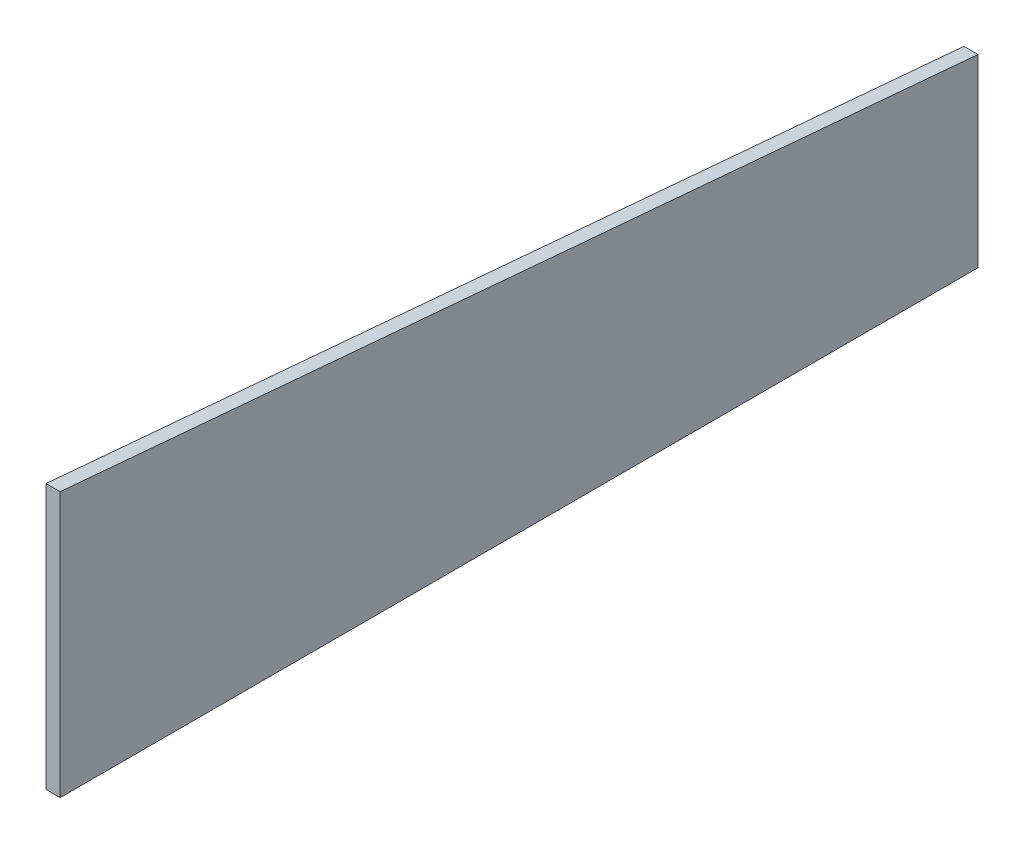
ISO-10303-21;
HEADER;
FILE_DESCRIPTION(('STEP AP214'),'2;1');
FILE_NAME('part.step','',(''),(''),'','','');
FILE_SCHEMA(('AUTOMOTIVE_DESIGN { 1 0 10303 214 1 1 1 1 }'));
ENDSEC;
DATA;
#1=APPLICATION_CONTEXT('core data for automotive mechanical design processes');
#2=APPLICATION_PROTOCOL_DEFINITION('international standard','automotive_design',2000,#1);
#3=PRODUCT_CONTEXT('',#1,'mechanical');
#4=PRODUCT('Part','Part','',(#3));
#5=PRODUCT_RELATED_PRODUCT_CATEGORY('part','',(#4));
#6=PRODUCT_DEFINITION_FORMATION('','',#4);
#7=PRODUCT_DEFINITION_CONTEXT('part definition',#1,'design');
#8=PRODUCT_DEFINITION('design','',#6,#7);
#9=PRODUCT_DEFINITION_SHAPE('','',#8);
#10=(LENGTH_UNIT() NAMED_UNIT(*) SI_UNIT(.MILLI.,.METRE.));
#11=(NAMED_UNIT(*) PLANE_ANGLE_UNIT() SI_UNIT($,.RADIAN.));
#12=(NAMED_UNIT(*) SI_UNIT($,.STERADIAN.) SOLID_ANGLE_UNIT());
#13=UNCERTAINTY_MEASURE_WITH_UNIT(LENGTH_MEASURE(1.E-05),#10,'distance_accuracy_value','');
#14=(GEOMETRIC_REPRESENTATION_CONTEXT(3) GLOBAL_UNCERTAINTY_ASSIGNED_CONTEXT((#13)) GLOBAL_UNIT_ASSIGNED_CONTEXT((#10,
#11,#12)) REPRESENTATION_CONTEXT('',''));
#15=CARTESIAN_POINT('',(0.,0.,0.));
#16=DIRECTION('',(0.,0.,1.));
#17=DIRECTION('',(1.,0.,0.));
#18=AXIS2_PLACEMENT_3D('',#15,#16,#17);
#19=CARTESIAN_POINT('',(75.3557689069101,0.,3.4487766090119));
#20=DIRECTION('',(-0.998954351961386,0.,-0.0457187346435417));
#21=DIRECTION('',(-0.0457187346435417,0.,0.998954351961386));
#22=AXIS2_PLACEMENT_3D('',#19,#20,#21);
#23=PLANE('',#22);
#24=DIRECTION('',(0.,-1.,0.));
#25=VECTOR('',#24,1.);
#26=CARTESIAN_POINT('',(36.8866053649885,0.,844.));
#27=LINE('',#26,#25);
#28=CARTESIAN_POINT('',(36.8866053649885,268.113394635012,844.));
#29=VERTEX_POINT('',#28);
#30=CARTESIAN_POINT('',(36.8866053649885,23.8729977116705,844.));
#31=VERTEX_POINT('',#30);
#32=EDGE_CURVE('E100',#29,#31,#27,.T.);
#33=ORIENTED_EDGE('',*,*,#32,.T.);
#34=DIRECTION('',(-0.0456710287056019,-0.0456710287056019,0.997911977217402));
#35=VECTOR('',#34,1.);
#36=CARTESIAN_POINT('',(75.2257329547936,62.2121253014756,6.29006216275832));
#37=LINE('',#36,#35);
#38=CARTESIAN_POINT('',(73.9117769896424,60.8981693363844,35.));
#39=VERTEX_POINT('',#38);
#40=EDGE_CURVE('E57',#39,#31,#37,.T.);
#41=ORIENTED_EDGE('',*,*,#40,.F.);
#42=DIRECTION('',(0.,-1.,0.));
#43=VECTOR('',#42,1.);
#44=CARTESIAN_POINT('',(73.9117769897024,0.,35.));
#45=LINE('',#44,#43);
#46=CARTESIAN_POINT('',(73.9117769896424,231.088223010298,35.));
#47=VERTEX_POINT('',#46);
#48=EDGE_CURVE('E11',#47,#39,#45,.T.);
#49=ORIENTED_EDGE('',*,*,#48,.F.);
#50=DIRECTION('',(-0.0456710287056019,0.045671028705602,0.997911977217402));
#51=VECTOR('',#50,1.);
#52=CARTESIAN_POINT('',(75.8347706873712,229.165229312629,-7.01741229406215));
#53=LINE('',#52,#51);
#54=EDGE_CURVE('E36',#47,#29,#53,.T.);
#55=ORIENTED_EDGE('',*,*,#54,.T.);
#56=EDGE_LOOP('',(#33,#41,#49,#55));
#57=FACE_BOUND('',#56,.T.);
#58=ADVANCED_FACE('F32',(#57),#23,.F.);
#59=CARTESIAN_POINT('',(0.,229.006719270381,-10.4808567171799));
#60=DIRECTION('',(0.,0.998954351961386,-0.0457187346435418));
#61=DIRECTION('',(0.,0.0457187346435418,0.998954351961386));
#62=AXIS2_PLACEMENT_3D('',#59,#60,#61);
#63=PLANE('',#62);
#64=DIRECTION('',(-1.,0.,0.));
#65=VECTOR('',#64,1.);
#66=CARTESIAN_POINT('',(0.,268.113394635012,844.));
#67=LINE('',#66,#65);
#68=CARTESIAN_POINT('',(23.8729977116705,268.113394635012,844.));
#69=VERTEX_POINT('',#68);
#70=EDGE_CURVE('E82',#29,#69,#67,.T.);
#71=ORIENTED_EDGE('',*,*,#70,.F.);
#72=ORIENTED_EDGE('',*,*,#54,.F.);
#73=DIRECTION('',(-1.,0.,0.));
#74=VECTOR('',#73,1.);
#75=CARTESIAN_POINT('',(0.,231.088223010298,35.));
#76=LINE('',#75,#74);
#77=CARTESIAN_POINT('',(60.8981693363844,231.088223010298,35.));
#78=VERTEX_POINT('',#77);
#79=EDGE_CURVE('E81',#47,#78,#76,.T.);
#80=ORIENTED_EDGE('',*,*,#79,.T.);
#81=DIRECTION('',(-0.0456710287056019,0.045671028705602,0.997911977217402));
#82=VECTOR('',#81,1.);
#83=CARTESIAN_POINT('',(62.8483073746991,229.138084971983,-7.61051613717548));
#84=LINE('',#83,#82);
#85=EDGE_CURVE('E93',#78,#69,#84,.T.);
#86=ORIENTED_EDGE('',*,*,#85,.T.);
#87=EDGE_LOOP('',(#71,#72,#80,#86));
#88=FACE_BOUND('',#87,.T.);
#89=ADVANCED_FACE('F78',(#88),#63,.T.);
#90=CARTESIAN_POINT('',(0.,0.,35.));
#91=DIRECTION('',(0.,0.,-1.));
#92=DIRECTION('',(-1.,0.,0.));
#93=AXIS2_PLACEMENT_3D('',#90,#91,#92);
#94=PLANE('',#93);
#95=ORIENTED_EDGE('',*,*,#48,.T.);
#96=DIRECTION('',(-1.,0.,0.));
#97=VECTOR('',#96,1.);
#98=CARTESIAN_POINT('',(0.,60.8981693363844,35.));
#99=LINE('',#98,#97);
#100=CARTESIAN_POINT('',(60.8981693363844,60.8981693363844,35.));
#101=VERTEX_POINT('',#100);
#102=EDGE_CURVE('E91',#39,#101,#99,.T.);
#103=ORIENTED_EDGE('',*,*,#102,.T.);
#104=DIRECTION('',(0.,1.,0.));
#105=VECTOR('',#104,1.);
#106=CARTESIAN_POINT('',(60.8981693363844,0.,35.));
#107=LINE('',#106,#105);
#108=EDGE_CURVE('E89',#101,#78,#107,.T.);
#109=ORIENTED_EDGE('',*,*,#108,.T.);
#110=ORIENTED_EDGE('',*,*,#79,.F.);
#111=EDGE_LOOP('',(#95,#103,#109,#110));
#112=FACE_BOUND('',#111,.T.);
#113=ADVANCED_FACE('F87',(#112),#94,.T.);
#114=CARTESIAN_POINT('',(0.,0.,844.));
#115=DIRECTION('',(0.,0.,1.));
#116=DIRECTION('',(1.,0.,0.));
#117=AXIS2_PLACEMENT_3D('',#114,#115,#116);
#118=PLANE('',#117);
#119=ORIENTED_EDGE('',*,*,#32,.F.);
#120=ORIENTED_EDGE('',*,*,#70,.T.);
#121=DIRECTION('',(0.,-1.,0.));
#122=VECTOR('',#121,1.);
#123=CARTESIAN_POINT('',(23.8729977116705,0.,844.));
#124=LINE('',#123,#122);
#125=CARTESIAN_POINT('',(23.8729977116705,23.8729977116704,844.));
#126=VERTEX_POINT('',#125);
#127=EDGE_CURVE('E49',#69,#126,#124,.T.);
#128=ORIENTED_EDGE('',*,*,#127,.T.);
#129=DIRECTION('',(1.,0.,0.));
#130=VECTOR('',#129,1.);
#131=CARTESIAN_POINT('',(0.,23.8729977116705,844.));
#132=LINE('',#131,#130);
#133=EDGE_CURVE('E41',#126,#31,#132,.T.);
#134=ORIENTED_EDGE('',*,*,#133,.T.);
#135=EDGE_LOOP('',(#119,#120,#128,#134));
#136=FACE_BOUND('',#135,.T.);
#137=ADVANCED_FACE('F106',(#136),#118,.T.);
#138=CARTESIAN_POINT('',(0.,62.3693623314121,2.85443305864586));
#139=DIRECTION('',(0.,0.998954351961386,0.0457187346435418));
#140=DIRECTION('',(0.,-0.0457187346435418,0.998954351961386));
#141=AXIS2_PLACEMENT_3D('',#138,#139,#140);
#142=PLANE('',#141);
#143=ORIENTED_EDGE('',*,*,#102,.F.);
#144=ORIENTED_EDGE('',*,*,#40,.T.);
#145=ORIENTED_EDGE('',*,*,#133,.F.);
#146=DIRECTION('',(-0.0456710287056019,-0.045671028705602,0.997911977217402));
#147=VECTOR('',#146,1.);
#148=CARTESIAN_POINT('',(62.5,62.5,0.));
#149=LINE('',#148,#147);
#150=EDGE_CURVE('E98',#101,#126,#149,.T.);
#151=ORIENTED_EDGE('',*,*,#150,.F.);
#152=EDGE_LOOP('',(#143,#144,#145,#151));
#153=FACE_BOUND('',#152,.T.);
#154=ADVANCED_FACE('F34',(#153),#142,.F.);
#155=CARTESIAN_POINT('',(62.3693623314121,0.,2.85443305864586));
#156=DIRECTION('',(0.998954351961386,0.,0.0457187346435417));
#157=DIRECTION('',(0.0457187346435417,0.,-0.998954351961386));
#158=AXIS2_PLACEMENT_3D('',#155,#156,#157);
#159=PLANE('',#158);
#160=ORIENTED_EDGE('',*,*,#108,.F.);
#161=ORIENTED_EDGE('',*,*,#150,.T.);
#162=ORIENTED_EDGE('',*,*,#127,.F.);
#163=ORIENTED_EDGE('',*,*,#85,.F.);
#164=EDGE_LOOP('',(#160,#161,#162,#163));
#165=FACE_BOUND('',#164,.T.);
#166=ADVANCED_FACE('F108',(#165),#159,.F.);
#167=CLOSED_SHELL('',(#58,#89,#113,#137,#154,#166));
#168=MANIFOLD_SOLID_BREP('B2',#167);
#169=ADVANCED_BREP_SHAPE_REPRESENTATION('',(#18,#168),#14);
#170=SHAPE_DEFINITION_REPRESENTATION(#9,#169);
ENDSEC;
END-ISO-10303-21;
